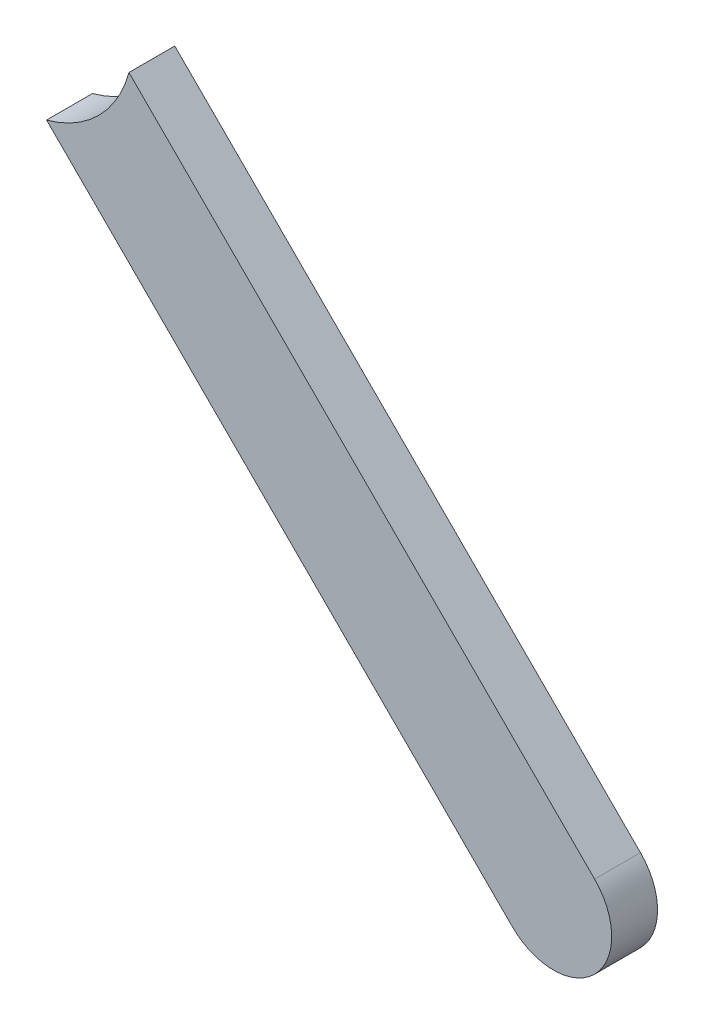
ISO-10303-21;
HEADER;
FILE_DESCRIPTION(('STEP AP214'),'2;1');
FILE_NAME('part.step','',(''),(''),'','','');
FILE_SCHEMA(('AUTOMOTIVE_DESIGN { 1 0 10303 214 1 1 1 1 }'));
ENDSEC;
DATA;
#1=APPLICATION_CONTEXT('core data for automotive mechanical design processes');
#2=APPLICATION_PROTOCOL_DEFINITION('international standard','automotive_design',2000,#1);
#3=PRODUCT_CONTEXT('',#1,'mechanical');
#4=PRODUCT('Part','Part','',(#3));
#5=PRODUCT_RELATED_PRODUCT_CATEGORY('part','',(#4));
#6=PRODUCT_DEFINITION_FORMATION('','',#4);
#7=PRODUCT_DEFINITION_CONTEXT('part definition',#1,'design');
#8=PRODUCT_DEFINITION('design','',#6,#7);
#9=PRODUCT_DEFINITION_SHAPE('','',#8);
#10=(LENGTH_UNIT() NAMED_UNIT(*) SI_UNIT(.MILLI.,.METRE.));
#11=(NAMED_UNIT(*) PLANE_ANGLE_UNIT() SI_UNIT($,.RADIAN.));
#12=(NAMED_UNIT(*) SI_UNIT($,.STERADIAN.) SOLID_ANGLE_UNIT());
#13=UNCERTAINTY_MEASURE_WITH_UNIT(LENGTH_MEASURE(1.E-05),#10,'distance_accuracy_value','');
#14=(GEOMETRIC_REPRESENTATION_CONTEXT(3) GLOBAL_UNCERTAINTY_ASSIGNED_CONTEXT((#13)) GLOBAL_UNIT_ASSIGNED_CONTEXT((#10,
#11,#12)) REPRESENTATION_CONTEXT('',''));
#15=CARTESIAN_POINT('',(0.,0.,0.));
#16=DIRECTION('',(0.,0.,1.));
#17=DIRECTION('',(1.,0.,0.));
#18=AXIS2_PLACEMENT_3D('',#15,#16,#17);
#19=CARTESIAN_POINT('',(90.3014787853028,103.903309334697,0.));
#20=DIRECTION('',(0.70710678118655,0.707106781186545,0.));
#21=DIRECTION('',(0.707106781186545,-0.70710678118655,0.));
#22=AXIS2_PLACEMENT_3D('',#19,#20,#21);
#23=PLANE('',#22);
#24=DIRECTION('',(0.707106781186545,-0.70710678118655,0.));
#25=VECTOR('',#24,1.);
#26=CARTESIAN_POINT('',(89.99039406,104.21439406,0.1999996));
#27=LINE('',#26,#25);
#28=CARTESIAN_POINT('',(90.3014787853028,103.903309334697,0.1999996));
#29=VERTEX_POINT('',#28);
#30=CARTESIAN_POINT('',(92.33288366,101.87190446,0.1999996));
#31=VERTEX_POINT('',#30);
#32=EDGE_CURVE('E11',#29,#31,#27,.T.);
#33=ORIENTED_EDGE('',*,*,#32,.F.);
#34=DIRECTION('',(0.,0.,1.));
#35=VECTOR('',#34,1.);
#36=CARTESIAN_POINT('',(90.3014787853028,103.903309334697,0.));
#37=LINE('',#36,#35);
#38=CARTESIAN_POINT('',(90.3014787853028,103.903309334697,0.));
#39=VERTEX_POINT('',#38);
#40=EDGE_CURVE('E24',#39,#29,#37,.T.);
#41=ORIENTED_EDGE('',*,*,#40,.F.);
#42=DIRECTION('',(0.707106781186545,-0.70710678118655,0.));
#43=VECTOR('',#42,1.);
#44=CARTESIAN_POINT('',(89.99039406,104.21439406,0.));
#45=LINE('',#44,#43);
#46=CARTESIAN_POINT('',(92.33288366,101.87190446,0.));
#47=VERTEX_POINT('',#46);
#48=EDGE_CURVE('E75',#39,#47,#45,.T.);
#49=ORIENTED_EDGE('',*,*,#48,.T.);
#50=DIRECTION('',(0.,0.,1.));
#51=VECTOR('',#50,1.);
#52=CARTESIAN_POINT('',(92.33288366,101.87190446,0.));
#53=LINE('',#52,#51);
#54=EDGE_CURVE('E37',#47,#31,#53,.T.);
#55=ORIENTED_EDGE('',*,*,#54,.T.);
#56=EDGE_LOOP('',(#33,#41,#49,#55));
#57=FACE_BOUND('',#56,.T.);
#58=ADVANCED_FACE('F17',(#57),#23,.F.);
#59=CARTESIAN_POINT('',(92.5124896,102.0515104,0.));
#60=DIRECTION('',(0.,0.,-1.));
#61=DIRECTION('',(-0.707106781186548,-0.707106781186548,0.));
#62=AXIS2_PLACEMENT_3D('',#59,#60,#61);
#63=CYLINDRICAL_SURFACE('',#62,0.254001156230771);
#64=CARTESIAN_POINT('',(92.5124896,102.0515104,0.1999996));
#65=DIRECTION('',(0.,0.,1.));
#66=DIRECTION('',(-0.707106781186548,-0.707106781186548,0.));
#67=AXIS2_PLACEMENT_3D('',#64,#65,#66);
#68=CIRCLE('',#67,0.254001156230771);
#69=CARTESIAN_POINT('',(92.69209554,102.23111634,0.1999996));
#70=VERTEX_POINT('',#69);
#71=EDGE_CURVE('E83',#31,#70,#68,.T.);
#72=ORIENTED_EDGE('',*,*,#71,.F.);
#73=ORIENTED_EDGE('',*,*,#54,.F.);
#74=CARTESIAN_POINT('',(92.5124896,102.0515104,0.));
#75=DIRECTION('',(0.,0.,1.));
#76=DIRECTION('',(-0.707106781186548,-0.707106781186548,0.));
#77=AXIS2_PLACEMENT_3D('',#74,#75,#76);
#78=CIRCLE('',#77,0.254001156230771);
#79=CARTESIAN_POINT('',(92.69209554,102.23111634,0.));
#80=VERTEX_POINT('',#79);
#81=EDGE_CURVE('E81',#47,#80,#78,.T.);
#82=ORIENTED_EDGE('',*,*,#81,.T.);
#83=DIRECTION('',(0.,0.,1.));
#84=VECTOR('',#83,1.);
#85=CARTESIAN_POINT('',(92.69209554,102.23111634,0.));
#86=LINE('',#85,#84);
#87=EDGE_CURVE('E67',#80,#70,#86,.T.);
#88=ORIENTED_EDGE('',*,*,#87,.T.);
#89=EDGE_LOOP('',(#72,#73,#82,#88));
#90=FACE_BOUND('',#89,.T.);
#91=ADVANCED_FACE('F89',(#90),#63,.T.);
#92=CARTESIAN_POINT('',(92.69209554,102.23111634,0.));
#93=DIRECTION('',(-0.707106781186545,-0.70710678118655,0.));
#94=DIRECTION('',(-0.70710678118655,0.707106781186545,0.));
#95=AXIS2_PLACEMENT_3D('',#92,#93,#94);
#96=PLANE('',#95);
#97=DIRECTION('',(-0.70710678118655,0.707106781186545,0.));
#98=VECTOR('',#97,1.);
#99=CARTESIAN_POINT('',(92.69209554,102.23111634,0.1999996));
#100=LINE('',#99,#98);
#101=CARTESIAN_POINT('',(90.6606906653028,104.262521214697,0.1999996));
#102=VERTEX_POINT('',#101);
#103=EDGE_CURVE('E71',#70,#102,#100,.T.);
#104=ORIENTED_EDGE('',*,*,#103,.F.);
#105=ORIENTED_EDGE('',*,*,#87,.F.);
#106=DIRECTION('',(-0.70710678118655,0.707106781186545,0.));
#107=VECTOR('',#106,1.);
#108=CARTESIAN_POINT('',(92.69209554,102.23111634,0.));
#109=LINE('',#108,#107);
#110=CARTESIAN_POINT('',(90.6606906653028,104.262521214697,0.));
#111=VERTEX_POINT('',#110);
#112=EDGE_CURVE('E63',#80,#111,#109,.T.);
#113=ORIENTED_EDGE('',*,*,#112,.T.);
#114=DIRECTION('',(0.,0.,1.));
#115=VECTOR('',#114,1.);
#116=CARTESIAN_POINT('',(90.6606906653028,104.262521214697,0.));
#117=LINE('',#116,#115);
#118=EDGE_CURVE('E53',#111,#102,#117,.T.);
#119=ORIENTED_EDGE('',*,*,#118,.T.);
#120=EDGE_LOOP('',(#104,#105,#113,#119));
#121=FACE_BOUND('',#120,.T.);
#122=ADVANCED_FACE('F66',(#121),#96,.F.);
#123=CARTESIAN_POINT('',(90.17,104.394,0.));
#124=DIRECTION('',(0.,0.,-1.));
#125=DIRECTION('',(1.,0.,0.));
#126=AXIS2_PLACEMENT_3D('',#123,#124,#125);
#127=CYLINDRICAL_SURFACE('',#126,0.508);
#128=ORIENTED_EDGE('',*,*,#40,.T.);
#129=CARTESIAN_POINT('',(90.17,104.394,0.1999996));
#130=DIRECTION('',(0.,0.,1.));
#131=DIRECTION('',(1.,0.,0.));
#132=AXIS2_PLACEMENT_3D('',#129,#130,#131);
#133=CIRCLE('',#132,0.508);
#134=EDGE_CURVE('E59',#29,#102,#133,.T.);
#135=ORIENTED_EDGE('',*,*,#134,.T.);
#136=ORIENTED_EDGE('',*,*,#118,.F.);
#137=CARTESIAN_POINT('',(90.17,104.394,0.));
#138=DIRECTION('',(0.,0.,1.));
#139=DIRECTION('',(1.,0.,0.));
#140=AXIS2_PLACEMENT_3D('',#137,#138,#139);
#141=CIRCLE('',#140,0.508);
#142=EDGE_CURVE('E57',#39,#111,#141,.T.);
#143=ORIENTED_EDGE('',*,*,#142,.F.);
#144=EDGE_LOOP('',(#128,#135,#136,#143));
#145=FACE_BOUND('',#144,.T.);
#146=ADVANCED_FACE('F55',(#145),#127,.F.);
#147=CARTESIAN_POINT('',(89.99039406,104.21439406,0.));
#148=DIRECTION('',(0.,0.,-1.));
#149=DIRECTION('',(-1.,0.,0.));
#150=AXIS2_PLACEMENT_3D('',#147,#148,#149);
#151=PLANE('',#150);
#152=ORIENTED_EDGE('',*,*,#48,.F.);
#153=ORIENTED_EDGE('',*,*,#142,.T.);
#154=ORIENTED_EDGE('',*,*,#112,.F.);
#155=ORIENTED_EDGE('',*,*,#81,.F.);
#156=EDGE_LOOP('',(#152,#153,#154,#155));
#157=FACE_BOUND('',#156,.T.);
#158=ADVANCED_FACE('F74',(#157),#151,.T.);
#159=CARTESIAN_POINT('',(89.99039406,104.21439406,0.1999996));
#160=DIRECTION('',(0.,0.,-1.));
#161=DIRECTION('',(-1.,0.,0.));
#162=AXIS2_PLACEMENT_3D('',#159,#160,#161);
#163=PLANE('',#162);
#164=ORIENTED_EDGE('',*,*,#134,.F.);
#165=ORIENTED_EDGE('',*,*,#32,.T.);
#166=ORIENTED_EDGE('',*,*,#71,.T.);
#167=ORIENTED_EDGE('',*,*,#103,.T.);
#168=EDGE_LOOP('',(#164,#165,#166,#167));
#169=FACE_BOUND('',#168,.T.);
#170=ADVANCED_FACE('F91',(#169),#163,.F.);
#171=CLOSED_SHELL('',(#58,#91,#122,#146,#158,#170));
#172=MANIFOLD_SOLID_BREP('B1',#171);
#173=ADVANCED_BREP_SHAPE_REPRESENTATION('',(#18,#172),#14);
#174=SHAPE_DEFINITION_REPRESENTATION(#9,#173);
ENDSEC;
END-ISO-10303-21;
